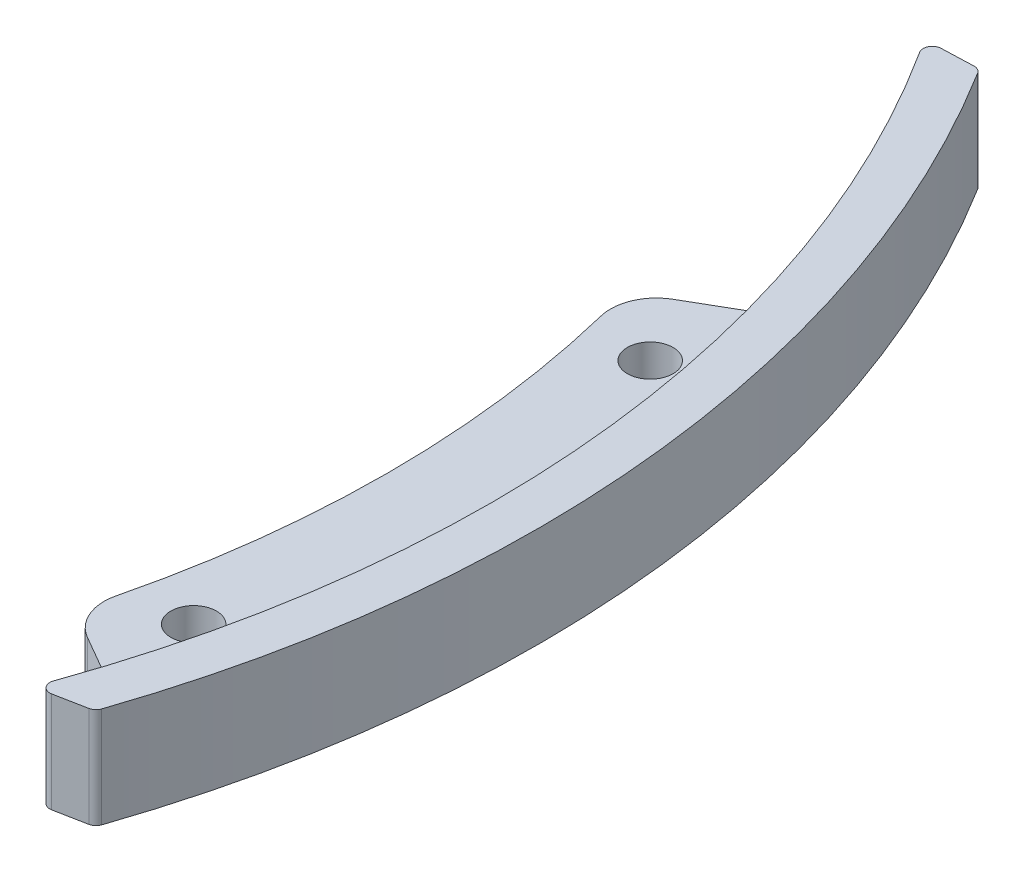
ISO-10303-21;
HEADER;
FILE_DESCRIPTION(('STEP AP214'),'2;1');
FILE_NAME('part.step','',(''),(''),'','','');
FILE_SCHEMA(('AUTOMOTIVE_DESIGN { 1 0 10303 214 1 1 1 1 }'));
ENDSEC;
DATA;
#1=APPLICATION_CONTEXT('core data for automotive mechanical design processes');
#2=APPLICATION_PROTOCOL_DEFINITION('international standard','automotive_design',2000,#1);
#3=PRODUCT_CONTEXT('',#1,'mechanical');
#4=PRODUCT('Part','Part','',(#3));
#5=PRODUCT_RELATED_PRODUCT_CATEGORY('part','',(#4));
#6=PRODUCT_DEFINITION_FORMATION('','',#4);
#7=PRODUCT_DEFINITION_CONTEXT('part definition',#1,'design');
#8=PRODUCT_DEFINITION('design','',#6,#7);
#9=PRODUCT_DEFINITION_SHAPE('','',#8);
#10=(LENGTH_UNIT() NAMED_UNIT(*) SI_UNIT(.MILLI.,.METRE.));
#11=(NAMED_UNIT(*) PLANE_ANGLE_UNIT() SI_UNIT($,.RADIAN.));
#12=(NAMED_UNIT(*) SI_UNIT($,.STERADIAN.) SOLID_ANGLE_UNIT());
#13=UNCERTAINTY_MEASURE_WITH_UNIT(LENGTH_MEASURE(1.E-05),#10,'distance_accuracy_value','');
#14=(GEOMETRIC_REPRESENTATION_CONTEXT(3) GLOBAL_UNCERTAINTY_ASSIGNED_CONTEXT((#13)) GLOBAL_UNIT_ASSIGNED_CONTEXT((#10,
#11,#12)) REPRESENTATION_CONTEXT('',''));
#15=CARTESIAN_POINT('',(0.,0.,0.));
#16=DIRECTION('',(0.,0.,1.));
#17=DIRECTION('',(1.,0.,0.));
#18=AXIS2_PLACEMENT_3D('',#15,#16,#17);
#19=CARTESIAN_POINT('',(0.,2.5,0.));
#20=DIRECTION('',(0.,1.,0.));
#21=DIRECTION('',(0.,0.,1.));
#22=AXIS2_PLACEMENT_3D('',#19,#20,#21);
#23=PLANE('',#22);
#24=CARTESIAN_POINT('',(114.80962503205,2.5,-25.));
#25=DIRECTION('',(0.,1.,0.));
#26=DIRECTION('',(0.,0.,1.));
#27=AXIS2_PLACEMENT_3D('',#24,#25,#26);
#28=CIRCLE('',#27,2.50000000000001);
#29=CARTESIAN_POINT('',(114.80962503205,2.5,-22.5));
#30=VERTEX_POINT('',#29);
#31=EDGE_CURVE('E263',#30,#30,#28,.T.);
#32=ORIENTED_EDGE('',*,*,#31,.F.);
#33=EDGE_LOOP('',(#32));
#34=FACE_BOUND('',#33,.T.);
#35=CARTESIAN_POINT('',(114.80962503205,2.5,25.));
#36=DIRECTION('',(0.,1.,0.));
#37=DIRECTION('',(0.,0.,1.));
#38=AXIS2_PLACEMENT_3D('',#35,#36,#37);
#39=CIRCLE('',#38,2.50000000000001);
#40=CARTESIAN_POINT('',(114.80962503205,2.5,27.5));
#41=VERTEX_POINT('',#40);
#42=EDGE_CURVE('E186',#41,#41,#39,.T.);
#43=ORIENTED_EDGE('',*,*,#42,.F.);
#44=EDGE_LOOP('',(#43));
#45=FACE_BOUND('',#44,.T.);
#46=CARTESIAN_POINT('',(0.,2.5,0.));
#47=DIRECTION('',(0.,1.,0.));
#48=DIRECTION('',(0.,0.,1.));
#49=AXIS2_PLACEMENT_3D('',#46,#47,#48);
#50=CIRCLE('',#49,111.1);
#51=CARTESIAN_POINT('',(107.884291904918,2.5,26.5365702413552));
#52=VERTEX_POINT('',#51);
#53=CARTESIAN_POINT('',(107.884291904918,2.5,-26.5365702413556));
#54=VERTEX_POINT('',#53);
#55=EDGE_CURVE('E254',#52,#54,#50,.T.);
#56=ORIENTED_EDGE('',*,*,#55,.F.);
#57=CARTESIAN_POINT('',(112.739570568506,2.5,27.7308353287249));
#58=DIRECTION('',(0.,1.,0.));
#59=DIRECTION('',(0.,0.,1.));
#60=AXIS2_PLACEMENT_3D('',#57,#58,#59);
#61=CIRCLE('',#60,5.);
#62=CARTESIAN_POINT('',(110.239570568506,2.5,32.0609623476471));
#63=VERTEX_POINT('',#62);
#64=EDGE_CURVE('E53',#52,#63,#61,.T.);
#65=ORIENTED_EDGE('',*,*,#64,.T.);
#66=DIRECTION('',(-0.866025403784437,0.,-0.500000000000003));
#67=VECTOR('',#66,1.);
#68=CARTESIAN_POINT('',(13.6770887107073,2.5,-23.6894125465716));
#69=LINE('',#68,#67);
#70=CARTESIAN_POINT('',(116.482793802061,2.5,35.6654889621512));
#71=VERTEX_POINT('',#70);
#72=EDGE_CURVE('E252',#71,#63,#69,.T.);
#73=ORIENTED_EDGE('',*,*,#72,.F.);
#74=CARTESIAN_POINT('',(115.982793802061,2.5,36.5315143659356));
#75=DIRECTION('',(0.,1.,0.));
#76=DIRECTION('',(0.,0.,1.));
#77=AXIS2_PLACEMENT_3D('',#74,#75,#76);
#78=CIRCLE('',#77,1.);
#79=CARTESIAN_POINT('',(116.936599672144,2.5,36.8319380038134));
#80=VERTEX_POINT('',#79);
#81=EDGE_CURVE('E234',#71,#80,#78,.F.);
#82=ORIENTED_EDGE('',*,*,#81,.T.);
#83=CARTESIAN_POINT('',(0.,2.5,0.));
#84=DIRECTION('',(0.,1.,0.));
#85=DIRECTION('',(0.,0.,1.));
#86=AXIS2_PLACEMENT_3D('',#83,#84,#85);
#87=CIRCLE('',#86,122.6);
#88=CARTESIAN_POINT('',(116.936599672144,2.5,-36.8319380038134));
#89=VERTEX_POINT('',#88);
#90=EDGE_CURVE('E279',#80,#89,#87,.T.);
#91=ORIENTED_EDGE('',*,*,#90,.T.);
#92=CARTESIAN_POINT('',(115.982793802061,2.5,-36.5315143659356));
#93=DIRECTION('',(0.,1.,0.));
#94=DIRECTION('',(0.,0.,1.));
#95=AXIS2_PLACEMENT_3D('',#92,#93,#94);
#96=CIRCLE('',#95,1.);
#97=CARTESIAN_POINT('',(116.482793802061,2.5,-35.6654889621512));
#98=VERTEX_POINT('',#97);
#99=EDGE_CURVE('E229',#89,#98,#96,.F.);
#100=ORIENTED_EDGE('',*,*,#99,.T.);
#101=DIRECTION('',(0.866025403784462,0.,-0.499999999999959));
#102=VECTOR('',#101,1.);
#103=CARTESIAN_POINT('',(13.6770887107031,2.5,23.6894125465671));
#104=LINE('',#103,#102);
#105=CARTESIAN_POINT('',(110.239570568506,2.5,-32.0609623476477));
#106=VERTEX_POINT('',#105);
#107=EDGE_CURVE('E286',#106,#98,#104,.T.);
#108=ORIENTED_EDGE('',*,*,#107,.F.);
#109=CARTESIAN_POINT('',(112.739570568506,2.5,-27.7308353287253));
#110=DIRECTION('',(0.,1.,0.));
#111=DIRECTION('',(0.,0.,1.));
#112=AXIS2_PLACEMENT_3D('',#109,#110,#111);
#113=CIRCLE('',#112,5.);
#114=EDGE_CURVE('E65',#106,#54,#113,.T.);
#115=ORIENTED_EDGE('',*,*,#114,.T.);
#116=EDGE_LOOP('',(#56,#65,#73,#82,#91,#100,#108,#115));
#117=FACE_BOUND('',#116,.T.);
#118=ADVANCED_FACE('F45',(#34,#45,#117),#23,.T.);
#119=CARTESIAN_POINT('',(0.,-2.5,0.));
#120=DIRECTION('',(0.,1.,0.));
#121=DIRECTION('',(0.,0.,1.));
#122=AXIS2_PLACEMENT_3D('',#119,#120,#121);
#123=PLANE('',#122);
#124=CARTESIAN_POINT('',(114.80962503205,-2.5,25.));
#125=DIRECTION('',(0.,1.,0.));
#126=DIRECTION('',(0.,0.,1.));
#127=AXIS2_PLACEMENT_3D('',#124,#125,#126);
#128=CIRCLE('',#127,2.50000000000001);
#129=CARTESIAN_POINT('',(114.80962503205,-2.5,27.5));
#130=VERTEX_POINT('',#129);
#131=EDGE_CURVE('E284',#130,#130,#128,.T.);
#132=ORIENTED_EDGE('',*,*,#131,.T.);
#133=EDGE_LOOP('',(#132));
#134=FACE_BOUND('',#133,.T.);
#135=CARTESIAN_POINT('',(114.80962503205,-2.5,-25.));
#136=DIRECTION('',(0.,1.,0.));
#137=DIRECTION('',(0.,0.,1.));
#138=AXIS2_PLACEMENT_3D('',#135,#136,#137);
#139=CIRCLE('',#138,2.50000000000001);
#140=CARTESIAN_POINT('',(114.80962503205,-2.5,-22.5));
#141=VERTEX_POINT('',#140);
#142=EDGE_CURVE('E277',#141,#141,#139,.T.);
#143=ORIENTED_EDGE('',*,*,#142,.T.);
#144=EDGE_LOOP('',(#143));
#145=FACE_BOUND('',#144,.T.);
#146=DIRECTION('',(-0.866025403784437,0.,-0.500000000000003));
#147=VECTOR('',#146,1.);
#148=CARTESIAN_POINT('',(13.6770887107073,-2.5,-23.6894125465716));
#149=LINE('',#148,#147);
#150=CARTESIAN_POINT('',(116.482793802061,-2.5,35.6654889621512));
#151=VERTEX_POINT('',#150);
#152=CARTESIAN_POINT('',(110.239570568506,-2.5,32.0609623476471));
#153=VERTEX_POINT('',#152);
#154=EDGE_CURVE('E271',#151,#153,#149,.T.);
#155=ORIENTED_EDGE('',*,*,#154,.T.);
#156=CARTESIAN_POINT('',(112.739570568506,-2.5,27.7308353287249));
#157=DIRECTION('',(0.,1.,0.));
#158=DIRECTION('',(0.,0.,1.));
#159=AXIS2_PLACEMENT_3D('',#156,#157,#158);
#160=CIRCLE('',#159,5.);
#161=CARTESIAN_POINT('',(107.884291904918,-2.5,26.5365702413552));
#162=VERTEX_POINT('',#161);
#163=EDGE_CURVE('E242',#153,#162,#160,.F.);
#164=ORIENTED_EDGE('',*,*,#163,.T.);
#165=CARTESIAN_POINT('',(0.,-2.5,0.));
#166=DIRECTION('',(0.,1.,0.));
#167=DIRECTION('',(0.,0.,1.));
#168=AXIS2_PLACEMENT_3D('',#165,#166,#167);
#169=CIRCLE('',#168,111.1);
#170=CARTESIAN_POINT('',(107.884291904918,-2.5,-26.5365702413556));
#171=VERTEX_POINT('',#170);
#172=EDGE_CURVE('E270',#162,#171,#169,.T.);
#173=ORIENTED_EDGE('',*,*,#172,.T.);
#174=CARTESIAN_POINT('',(112.739570568506,-2.5,-27.7308353287253));
#175=DIRECTION('',(0.,1.,0.));
#176=DIRECTION('',(0.,0.,1.));
#177=AXIS2_PLACEMENT_3D('',#174,#175,#176);
#178=CIRCLE('',#177,5.);
#179=CARTESIAN_POINT('',(110.239570568506,-2.5,-32.0609623476477));
#180=VERTEX_POINT('',#179);
#181=EDGE_CURVE('E240',#171,#180,#178,.F.);
#182=ORIENTED_EDGE('',*,*,#181,.T.);
#183=DIRECTION('',(0.866025403784462,0.,-0.499999999999959));
#184=VECTOR('',#183,1.);
#185=CARTESIAN_POINT('',(13.6770887107031,-2.5,23.6894125465671));
#186=LINE('',#185,#184);
#187=CARTESIAN_POINT('',(116.482793802061,-2.5,-35.6654889621512));
#188=VERTEX_POINT('',#187);
#189=EDGE_CURVE('E275',#180,#188,#186,.T.);
#190=ORIENTED_EDGE('',*,*,#189,.T.);
#191=CARTESIAN_POINT('',(115.982793802061,-2.5,-36.5315143659356));
#192=DIRECTION('',(0.,1.,0.));
#193=DIRECTION('',(0.,0.,1.));
#194=AXIS2_PLACEMENT_3D('',#191,#192,#193);
#195=CIRCLE('',#194,1.);
#196=CARTESIAN_POINT('',(116.936599672144,-2.5,-36.8319380038134));
#197=VERTEX_POINT('',#196);
#198=EDGE_CURVE('E226',#188,#197,#195,.T.);
#199=ORIENTED_EDGE('',*,*,#198,.T.);
#200=CARTESIAN_POINT('',(0.,-2.5,0.));
#201=DIRECTION('',(0.,1.,0.));
#202=DIRECTION('',(0.,0.,1.));
#203=AXIS2_PLACEMENT_3D('',#200,#201,#202);
#204=CIRCLE('',#203,122.6);
#205=CARTESIAN_POINT('',(116.936599672144,-2.5,36.8319380038134));
#206=VERTEX_POINT('',#205);
#207=EDGE_CURVE('E183',#206,#197,#204,.T.);
#208=ORIENTED_EDGE('',*,*,#207,.F.);
#209=CARTESIAN_POINT('',(115.982793802061,-2.5,36.5315143659356));
#210=DIRECTION('',(0.,1.,0.));
#211=DIRECTION('',(0.,0.,1.));
#212=AXIS2_PLACEMENT_3D('',#209,#210,#211);
#213=CIRCLE('',#212,1.);
#214=EDGE_CURVE('E232',#206,#151,#213,.T.);
#215=ORIENTED_EDGE('',*,*,#214,.T.);
#216=EDGE_LOOP('',(#155,#164,#173,#182,#190,#199,#208,#215));
#217=FACE_BOUND('',#216,.T.);
#218=ADVANCED_FACE('F269',(#134,#145,#217),#123,.F.);
#219=CARTESIAN_POINT('',(-2.26356606892201,2.5,-63.7598327213274));
#220=DIRECTION('',(-0.0354790919893731,0.,-0.99937041882958));
#221=DIRECTION('',(-0.99937041882958,0.,0.0354790919893731));
#222=AXIS2_PLACEMENT_3D('',#219,#220,#221);
#223=PLANE('',#222);
#224=DIRECTION('',(0.99937041882958,0.,-0.0354790919893731));
#225=VECTOR('',#224,1.);
#226=CARTESIAN_POINT('',(-2.26356606892201,5.5,-63.7598327213274));
#227=LINE('',#226,#225);
#228=CARTESIAN_POINT('',(104.126538049028,5.5,-67.5368349415656));
#229=VERTEX_POINT('',#228);
#230=CARTESIAN_POINT('',(107.593201699352,5.5,-67.6599065036498));
#231=VERTEX_POINT('',#230);
#232=EDGE_CURVE('E395',#229,#231,#227,.T.);
#233=ORIENTED_EDGE('',*,*,#232,.T.);
#234=DIRECTION('',(0.,-1.,0.));
#235=VECTOR('',#234,1.);
#236=CARTESIAN_POINT('',(107.593201699352,2.5,-67.6599065036498));
#237=LINE('',#236,#235);
#238=CARTESIAN_POINT('',(107.593201699352,-5.5,-67.6599065036498));
#239=VERTEX_POINT('',#238);
#240=EDGE_CURVE('E178',#231,#239,#237,.T.);
#241=ORIENTED_EDGE('',*,*,#240,.T.);
#242=DIRECTION('',(0.99937041882958,0.,-0.0354790919893731));
#243=VECTOR('',#242,1.);
#244=CARTESIAN_POINT('',(-2.26356606892201,-5.5,-63.7598327213274));
#245=LINE('',#244,#243);
#246=CARTESIAN_POINT('',(104.126538049028,-5.5,-67.5368349415656));
#247=VERTEX_POINT('',#246);
#248=EDGE_CURVE('E161',#247,#239,#245,.T.);
#249=ORIENTED_EDGE('',*,*,#248,.F.);
#250=DIRECTION('',(0.,1.,0.));
#251=VECTOR('',#250,1.);
#252=CARTESIAN_POINT('',(104.126538049028,5.5,-67.5368349415656));
#253=LINE('',#252,#251);
#254=EDGE_CURVE('E175',#247,#229,#253,.T.);
#255=ORIENTED_EDGE('',*,*,#254,.T.);
#256=EDGE_LOOP('',(#233,#241,#249,#255));
#257=FACE_BOUND('',#256,.T.);
#258=ADVANCED_FACE('F174',(#257),#223,.T.);
#259=CARTESIAN_POINT('',(13.6770887107031,2.5,23.6894125465671));
#260=DIRECTION('',(-0.499999999999959,0.,-0.866025403784462));
#261=DIRECTION('',(-0.866025403784462,0.,0.499999999999959));
#262=AXIS2_PLACEMENT_3D('',#259,#260,#261);
#263=PLANE('',#262);
#264=ORIENTED_EDGE('',*,*,#189,.F.);
#265=DIRECTION('',(0.,-1.,0.));
#266=VECTOR('',#265,1.);
#267=CARTESIAN_POINT('',(110.239570568506,2.5,-32.0609623476477));
#268=LINE('',#267,#266);
#269=EDGE_CURVE('E11',#180,#106,#268,.F.);
#270=ORIENTED_EDGE('',*,*,#269,.T.);
#271=ORIENTED_EDGE('',*,*,#107,.T.);
#272=DIRECTION('',(0.,-1.,0.));
#273=VECTOR('',#272,1.);
#274=CARTESIAN_POINT('',(116.482793802061,2.5,-35.6654889621512));
#275=LINE('',#274,#273);
#276=EDGE_CURVE('E221',#98,#188,#275,.T.);
#277=ORIENTED_EDGE('',*,*,#276,.T.);
#278=EDGE_LOOP('',(#264,#270,#271,#277));
#279=FACE_BOUND('',#278,.T.);
#280=ADVANCED_FACE('F336',(#279),#263,.T.);
#281=CARTESIAN_POINT('',(0.,2.5,0.));
#282=DIRECTION('',(0.,-1.,0.));
#283=DIRECTION('',(0.,0.,-1.));
#284=AXIS2_PLACEMENT_3D('',#281,#282,#283);
#285=CYLINDRICAL_SURFACE('',#284,111.1);
#286=ORIENTED_EDGE('',*,*,#172,.F.);
#287=DIRECTION('',(0.,-1.,0.));
#288=VECTOR('',#287,1.);
#289=CARTESIAN_POINT('',(107.884291904918,2.5,26.5365702413552));
#290=LINE('',#289,#288);
#291=EDGE_CURVE('E247',#162,#52,#290,.F.);
#292=ORIENTED_EDGE('',*,*,#291,.T.);
#293=ORIENTED_EDGE('',*,*,#55,.T.);
#294=DIRECTION('',(0.,-1.,0.));
#295=VECTOR('',#294,1.);
#296=CARTESIAN_POINT('',(107.884291904918,2.5,-26.5365702413556));
#297=LINE('',#296,#295);
#298=EDGE_CURVE('E244',#54,#171,#297,.T.);
#299=ORIENTED_EDGE('',*,*,#298,.T.);
#300=EDGE_LOOP('',(#286,#292,#293,#299));
#301=FACE_BOUND('',#300,.T.);
#302=ADVANCED_FACE('F273',(#301),#285,.F.);
#303=CARTESIAN_POINT('',(13.6770887107073,2.5,-23.6894125465716));
#304=DIRECTION('',(-0.500000000000003,0.,0.866025403784437));
#305=DIRECTION('',(0.866025403784437,0.,0.500000000000003));
#306=AXIS2_PLACEMENT_3D('',#303,#304,#305);
#307=PLANE('',#306);
#308=ORIENTED_EDGE('',*,*,#72,.T.);
#309=DIRECTION('',(0.,-1.,0.));
#310=VECTOR('',#309,1.);
#311=CARTESIAN_POINT('',(110.239570568506,2.5,32.0609623476471));
#312=LINE('',#311,#310);
#313=EDGE_CURVE('E237',#63,#153,#312,.T.);
#314=ORIENTED_EDGE('',*,*,#313,.T.);
#315=ORIENTED_EDGE('',*,*,#154,.F.);
#316=DIRECTION('',(0.,-1.,0.));
#317=VECTOR('',#316,1.);
#318=CARTESIAN_POINT('',(116.482793802061,2.5,35.6654889621512));
#319=LINE('',#318,#317);
#320=EDGE_CURVE('E224',#151,#71,#319,.F.);
#321=ORIENTED_EDGE('',*,*,#320,.T.);
#322=EDGE_LOOP('',(#308,#314,#315,#321));
#323=FACE_BOUND('',#322,.T.);
#324=ADVANCED_FACE('F259',(#323),#307,.T.);
#325=CARTESIAN_POINT('',(0.,2.5,0.));
#326=DIRECTION('',(0.,-1.,0.));
#327=DIRECTION('',(0.,0.,-1.));
#328=AXIS2_PLACEMENT_3D('',#325,#326,#327);
#329=CYLINDRICAL_SURFACE('',#328,122.6);
#330=CARTESIAN_POINT('',(0.,-5.5,0.));
#331=DIRECTION('',(0.,1.,0.));
#332=DIRECTION('',(0.,0.,1.));
#333=AXIS2_PLACEMENT_3D('',#330,#331,#332);
#334=CIRCLE('',#333,122.6);
#335=CARTESIAN_POINT('',(103.319282374505,-5.5,-65.999135521743));
#336=VERTEX_POINT('',#335);
#337=CARTESIAN_POINT('',(115.51779098221,-5.5,41.065800449894));
#338=VERTEX_POINT('',#337);
#339=EDGE_CURVE('E163',#336,#338,#334,.F.);
#340=ORIENTED_EDGE('',*,*,#339,.T.);
#341=DIRECTION('',(0.,-1.,0.));
#342=VECTOR('',#341,1.);
#343=CARTESIAN_POINT('',(115.51779098221,2.5,41.065800449894));
#344=LINE('',#343,#342);
#345=CARTESIAN_POINT('',(115.51779098221,5.5,41.065800449894));
#346=VERTEX_POINT('',#345);
#347=EDGE_CURVE('E219',#338,#346,#344,.F.);
#348=ORIENTED_EDGE('',*,*,#347,.T.);
#349=CARTESIAN_POINT('',(0.,5.5,0.));
#350=DIRECTION('',(0.,1.,0.));
#351=DIRECTION('',(0.,0.,1.));
#352=AXIS2_PLACEMENT_3D('',#349,#350,#351);
#353=CIRCLE('',#352,122.6);
#354=CARTESIAN_POINT('',(103.319282374505,5.5,-65.999135521743));
#355=VERTEX_POINT('',#354);
#356=EDGE_CURVE('E386',#355,#346,#353,.F.);
#357=ORIENTED_EDGE('',*,*,#356,.F.);
#358=DIRECTION('',(0.,-1.,0.));
#359=VECTOR('',#358,1.);
#360=CARTESIAN_POINT('',(103.319282374505,2.5,-65.999135521743));
#361=LINE('',#360,#359);
#362=EDGE_CURVE('E217',#355,#336,#361,.T.);
#363=ORIENTED_EDGE('',*,*,#362,.T.);
#364=EDGE_LOOP('',(#340,#348,#357,#363));
#365=FACE_BOUND('',#364,.T.);
#366=ORIENTED_EDGE('',*,*,#207,.T.);
#367=DIRECTION('',(0.,-1.,0.));
#368=VECTOR('',#367,1.);
#369=CARTESIAN_POINT('',(116.936599672144,2.5,-36.8319380038134));
#370=LINE('',#369,#368);
#371=EDGE_CURVE('E214',#197,#89,#370,.F.);
#372=ORIENTED_EDGE('',*,*,#371,.T.);
#373=ORIENTED_EDGE('',*,*,#90,.F.);
#374=DIRECTION('',(0.,-1.,0.));
#375=VECTOR('',#374,1.);
#376=CARTESIAN_POINT('',(116.936599672144,2.5,36.8319380038134));
#377=LINE('',#376,#375);
#378=EDGE_CURVE('E211',#80,#206,#377,.T.);
#379=ORIENTED_EDGE('',*,*,#378,.T.);
#380=EDGE_LOOP('',(#366,#372,#373,#379));
#381=FACE_BOUND('',#380,.T.);
#382=ADVANCED_FACE('F327',(#365,#381),#329,.F.);
#383=CARTESIAN_POINT('',(12.1372905782304,2.5,62.6348639131571));
#384=DIRECTION('',(-0.190239664235583,0.,-0.981737678889597));
#385=DIRECTION('',(-0.981737678889597,0.,0.190239664235583));
#386=AXIS2_PLACEMENT_3D('',#383,#384,#385);
#387=PLANE('',#386);
#388=DIRECTION('',(0.981737678889597,0.,-0.190239664235583));
#389=VECTOR('',#388,1.);
#390=CARTESIAN_POINT('',(12.1372905782304,5.5,62.6348639131571));
#391=LINE('',#390,#389);
#392=CARTESIAN_POINT('',(116.650263851847,5.5,42.3824957180975));
#393=VERTEX_POINT('',#392);
#394=CARTESIAN_POINT('',(120.055762215052,5.5,41.7225833208228));
#395=VERTEX_POINT('',#394);
#396=EDGE_CURVE('E381',#393,#395,#391,.T.);
#397=ORIENTED_EDGE('',*,*,#396,.F.);
#398=DIRECTION('',(0.,-1.,0.));
#399=VECTOR('',#398,1.);
#400=CARTESIAN_POINT('',(116.650263851847,2.5,42.3824957180975));
#401=LINE('',#400,#399);
#402=CARTESIAN_POINT('',(116.650263851847,-5.5,42.3824957180975));
#403=VERTEX_POINT('',#402);
#404=EDGE_CURVE('E208',#393,#403,#401,.T.);
#405=ORIENTED_EDGE('',*,*,#404,.T.);
#406=DIRECTION('',(0.981737678889597,0.,-0.190239664235583));
#407=VECTOR('',#406,1.);
#408=CARTESIAN_POINT('',(12.1372905782304,-5.5,62.6348639131571));
#409=LINE('',#408,#407);
#410=CARTESIAN_POINT('',(120.055762215052,-5.5,41.7225833208228));
#411=VERTEX_POINT('',#410);
#412=EDGE_CURVE('E391',#403,#411,#409,.T.);
#413=ORIENTED_EDGE('',*,*,#412,.T.);
#414=DIRECTION('',(0.,1.,0.));
#415=VECTOR('',#414,1.);
#416=CARTESIAN_POINT('',(120.055762215052,5.5,41.7225833208229));
#417=LINE('',#416,#415);
#418=EDGE_CURVE('E206',#411,#395,#417,.T.);
#419=ORIENTED_EDGE('',*,*,#418,.T.);
#420=EDGE_LOOP('',(#397,#405,#413,#419));
#421=FACE_BOUND('',#420,.T.);
#422=ADVANCED_FACE('F320',(#421),#387,.F.);
#423=CARTESIAN_POINT('',(114.80962503205,2.5,-25.));
#424=DIRECTION('',(0.,-1.,0.));
#425=DIRECTION('',(0.,0.,-1.));
#426=AXIS2_PLACEMENT_3D('',#423,#424,#425);
#427=CYLINDRICAL_SURFACE('',#426,2.50000000000001);
#428=ORIENTED_EDGE('',*,*,#31,.T.);
#429=EDGE_LOOP('',(#428));
#430=FACE_BOUND('',#429,.T.);
#431=ORIENTED_EDGE('',*,*,#142,.F.);
#432=EDGE_LOOP('',(#431));
#433=FACE_BOUND('',#432,.T.);
#434=ADVANCED_FACE('F317',(#430,#433),#427,.F.);
#435=CARTESIAN_POINT('',(0.,2.5,0.));
#436=DIRECTION('',(0.,-1.,0.));
#437=DIRECTION('',(0.,0.,-1.));
#438=AXIS2_PLACEMENT_3D('',#435,#436,#437);
#439=CYLINDRICAL_SURFACE('',#438,127.6);
#440=CARTESIAN_POINT('',(0.,-5.5,0.));
#441=DIRECTION('',(0.,1.,0.));
#442=DIRECTION('',(0.,0.,1.));
#443=AXIS2_PLACEMENT_3D('',#440,#441,#442);
#444=CIRCLE('',#443,127.6);
#445=CARTESIAN_POINT('',(108.478828348935,-5.5,-67.1870806036576));
#446=VERTEX_POINT('',#445);
#447=CARTESIAN_POINT('',(120.812327626257,-5.5,41.0626532694367));
#448=VERTEX_POINT('',#447);
#449=EDGE_CURVE('E393',#446,#448,#444,.F.);
#450=ORIENTED_EDGE('',*,*,#449,.F.);
#451=DIRECTION('',(0.,-1.,0.));
#452=VECTOR('',#451,1.);
#453=CARTESIAN_POINT('',(108.478828348935,2.5,-67.1870806036576));
#454=LINE('',#453,#452);
#455=CARTESIAN_POINT('',(108.478828348935,5.5,-67.1870806036576));
#456=VERTEX_POINT('',#455);
#457=EDGE_CURVE('E197',#446,#456,#454,.F.);
#458=ORIENTED_EDGE('',*,*,#457,.T.);
#459=CARTESIAN_POINT('',(0.,5.5,0.));
#460=DIRECTION('',(0.,1.,0.));
#461=DIRECTION('',(0.,0.,1.));
#462=AXIS2_PLACEMENT_3D('',#459,#460,#461);
#463=CIRCLE('',#462,127.6);
#464=CARTESIAN_POINT('',(120.812327626257,5.5,41.0626532694367));
#465=VERTEX_POINT('',#464);
#466=EDGE_CURVE('E379',#456,#465,#463,.F.);
#467=ORIENTED_EDGE('',*,*,#466,.T.);
#468=DIRECTION('',(0.,-1.,0.));
#469=VECTOR('',#468,1.);
#470=CARTESIAN_POINT('',(120.812327626257,2.5,41.0626532694367));
#471=LINE('',#470,#469);
#472=EDGE_CURVE('E194',#465,#448,#471,.T.);
#473=ORIENTED_EDGE('',*,*,#472,.T.);
#474=EDGE_LOOP('',(#450,#458,#467,#473));
#475=FACE_BOUND('',#474,.T.);
#476=ADVANCED_FACE('F316',(#475),#439,.T.);
#477=CARTESIAN_POINT('',(114.80962503205,2.5,25.));
#478=DIRECTION('',(0.,-1.,0.));
#479=DIRECTION('',(0.,0.,-1.));
#480=AXIS2_PLACEMENT_3D('',#477,#478,#479);
#481=CYLINDRICAL_SURFACE('',#480,2.50000000000001);
#482=ORIENTED_EDGE('',*,*,#42,.T.);
#483=EDGE_LOOP('',(#482));
#484=FACE_BOUND('',#483,.T.);
#485=ORIENTED_EDGE('',*,*,#131,.F.);
#486=EDGE_LOOP('',(#485));
#487=FACE_BOUND('',#486,.T.);
#488=ADVANCED_FACE('F298',(#484,#487),#481,.F.);
#489=CARTESIAN_POINT('',(0.,-5.5,0.));
#490=DIRECTION('',(0.,1.,0.));
#491=DIRECTION('',(0.,0.,1.));
#492=AXIS2_PLACEMENT_3D('',#489,#490,#491);
#493=PLANE('',#492);
#494=ORIENTED_EDGE('',*,*,#248,.T.);
#495=CARTESIAN_POINT('',(107.628680791341,-5.5,-66.6605360848202));
#496=DIRECTION('',(0.,1.,0.));
#497=DIRECTION('',(0.,0.,1.));
#498=AXIS2_PLACEMENT_3D('',#495,#496,#497);
#499=CIRCLE('',#498,1.);
#500=EDGE_CURVE('E192',#239,#446,#499,.F.);
#501=ORIENTED_EDGE('',*,*,#500,.T.);
#502=ORIENTED_EDGE('',*,*,#449,.T.);
#503=CARTESIAN_POINT('',(119.865522550816,-5.5,40.7408456419333));
#504=DIRECTION('',(0.,1.,0.));
#505=DIRECTION('',(0.,0.,1.));
#506=AXIS2_PLACEMENT_3D('',#503,#504,#505);
#507=CIRCLE('',#506,1.);
#508=EDGE_CURVE('E169',#448,#411,#507,.F.);
#509=ORIENTED_EDGE('',*,*,#508,.T.);
#510=ORIENTED_EDGE('',*,*,#412,.F.);
#511=CARTESIAN_POINT('',(116.460024187611,-5.5,41.4007580392079));
#512=DIRECTION('',(0.,1.,0.));
#513=DIRECTION('',(0.,0.,1.));
#514=AXIS2_PLACEMENT_3D('',#511,#512,#513);
#515=CIRCLE('',#514,1.);
#516=EDGE_CURVE('E168',#403,#338,#515,.F.);
#517=ORIENTED_EDGE('',*,*,#516,.T.);
#518=ORIENTED_EDGE('',*,*,#339,.F.);
#519=CARTESIAN_POINT('',(104.162017141018,-5.5,-66.537464522736));
#520=DIRECTION('',(0.,1.,0.));
#521=DIRECTION('',(0.,0.,1.));
#522=AXIS2_PLACEMENT_3D('',#519,#520,#521);
#523=CIRCLE('',#522,1.);
#524=EDGE_CURVE('E158',#336,#247,#523,.F.);
#525=ORIENTED_EDGE('',*,*,#524,.T.);
#526=EDGE_LOOP('',(#494,#501,#502,#509,#510,#517,#518,#525));
#527=FACE_BOUND('',#526,.T.);
#528=ADVANCED_FACE('F160',(#527),#493,.F.);
#529=CARTESIAN_POINT('',(0.,5.5,0.));
#530=DIRECTION('',(0.,1.,0.));
#531=DIRECTION('',(0.,0.,1.));
#532=AXIS2_PLACEMENT_3D('',#529,#530,#531);
#533=PLANE('',#532);
#534=ORIENTED_EDGE('',*,*,#466,.F.);
#535=CARTESIAN_POINT('',(107.628680791341,5.5,-66.6605360848202));
#536=DIRECTION('',(0.,1.,0.));
#537=DIRECTION('',(0.,0.,1.));
#538=AXIS2_PLACEMENT_3D('',#535,#536,#537);
#539=CIRCLE('',#538,1.);
#540=EDGE_CURVE('E204',#456,#231,#539,.T.);
#541=ORIENTED_EDGE('',*,*,#540,.T.);
#542=ORIENTED_EDGE('',*,*,#232,.F.);
#543=CARTESIAN_POINT('',(104.162017141018,5.5,-66.537464522736));
#544=DIRECTION('',(0.,1.,0.));
#545=DIRECTION('',(0.,0.,1.));
#546=AXIS2_PLACEMENT_3D('',#543,#544,#545);
#547=CIRCLE('',#546,1.);
#548=EDGE_CURVE('E182',#229,#355,#547,.T.);
#549=ORIENTED_EDGE('',*,*,#548,.T.);
#550=ORIENTED_EDGE('',*,*,#356,.T.);
#551=CARTESIAN_POINT('',(116.460024187611,5.5,41.4007580392079));
#552=DIRECTION('',(0.,1.,0.));
#553=DIRECTION('',(0.,0.,1.));
#554=AXIS2_PLACEMENT_3D('',#551,#552,#553);
#555=CIRCLE('',#554,1.);
#556=EDGE_CURVE('E202',#346,#393,#555,.T.);
#557=ORIENTED_EDGE('',*,*,#556,.T.);
#558=ORIENTED_EDGE('',*,*,#396,.T.);
#559=CARTESIAN_POINT('',(119.865522550816,5.5,40.7408456419333));
#560=DIRECTION('',(0.,1.,0.));
#561=DIRECTION('',(0.,0.,1.));
#562=AXIS2_PLACEMENT_3D('',#559,#560,#561);
#563=CIRCLE('',#562,1.);
#564=EDGE_CURVE('E199',#395,#465,#563,.T.);
#565=ORIENTED_EDGE('',*,*,#564,.T.);
#566=EDGE_LOOP('',(#534,#541,#542,#549,#550,#557,#558,#565));
#567=FACE_BOUND('',#566,.T.);
#568=ADVANCED_FACE('F345',(#567),#533,.T.);
#569=CARTESIAN_POINT('',(107.628680791341,2.5,-66.6605360848202));
#570=DIRECTION('',(0.,-1.,0.));
#571=DIRECTION('',(0.,0.,-1.));
#572=AXIS2_PLACEMENT_3D('',#569,#570,#571);
#573=CYLINDRICAL_SURFACE('',#572,1.);
#574=ORIENTED_EDGE('',*,*,#540,.F.);
#575=ORIENTED_EDGE('',*,*,#457,.F.);
#576=ORIENTED_EDGE('',*,*,#500,.F.);
#577=ORIENTED_EDGE('',*,*,#240,.F.);
#578=EDGE_LOOP('',(#574,#575,#576,#577));
#579=FACE_BOUND('',#578,.T.);
#580=ADVANCED_FACE('F341',(#579),#573,.T.);
#581=CARTESIAN_POINT('',(116.460024187611,2.5,41.4007580392079));
#582=DIRECTION('',(0.,-1.,0.));
#583=DIRECTION('',(0.,0.,-1.));
#584=AXIS2_PLACEMENT_3D('',#581,#582,#583);
#585=CYLINDRICAL_SURFACE('',#584,1.);
#586=ORIENTED_EDGE('',*,*,#556,.F.);
#587=ORIENTED_EDGE('',*,*,#347,.F.);
#588=ORIENTED_EDGE('',*,*,#516,.F.);
#589=ORIENTED_EDGE('',*,*,#404,.F.);
#590=EDGE_LOOP('',(#586,#587,#588,#589));
#591=FACE_BOUND('',#590,.T.);
#592=ADVANCED_FACE('F344',(#591),#585,.T.);
#593=CARTESIAN_POINT('',(104.162017141018,2.5,-66.537464522736));
#594=DIRECTION('',(0.,-1.,0.));
#595=DIRECTION('',(0.,0.,-1.));
#596=AXIS2_PLACEMENT_3D('',#593,#594,#595);
#597=CYLINDRICAL_SURFACE('',#596,1.);
#598=ORIENTED_EDGE('',*,*,#548,.F.);
#599=ORIENTED_EDGE('',*,*,#254,.F.);
#600=ORIENTED_EDGE('',*,*,#524,.F.);
#601=ORIENTED_EDGE('',*,*,#362,.F.);
#602=EDGE_LOOP('',(#598,#599,#600,#601));
#603=FACE_BOUND('',#602,.T.);
#604=ADVANCED_FACE('F181',(#603),#597,.T.);
#605=CARTESIAN_POINT('',(119.865522550816,2.5,40.7408456419333));
#606=DIRECTION('',(0.,-1.,0.));
#607=DIRECTION('',(0.,0.,-1.));
#608=AXIS2_PLACEMENT_3D('',#605,#606,#607);
#609=CYLINDRICAL_SURFACE('',#608,1.);
#610=ORIENTED_EDGE('',*,*,#564,.F.);
#611=ORIENTED_EDGE('',*,*,#418,.F.);
#612=ORIENTED_EDGE('',*,*,#508,.F.);
#613=ORIENTED_EDGE('',*,*,#472,.F.);
#614=EDGE_LOOP('',(#610,#611,#612,#613));
#615=FACE_BOUND('',#614,.T.);
#616=ADVANCED_FACE('F352',(#615),#609,.T.);
#617=CARTESIAN_POINT('',(115.982793802061,2.5,-36.5315143659356));
#618=DIRECTION('',(0.,-1.,0.));
#619=DIRECTION('',(0.,0.,-1.));
#620=AXIS2_PLACEMENT_3D('',#617,#618,#619);
#621=CYLINDRICAL_SURFACE('',#620,1.);
#622=ORIENTED_EDGE('',*,*,#99,.F.);
#623=ORIENTED_EDGE('',*,*,#371,.F.);
#624=ORIENTED_EDGE('',*,*,#198,.F.);
#625=ORIENTED_EDGE('',*,*,#276,.F.);
#626=EDGE_LOOP('',(#622,#623,#624,#625));
#627=FACE_BOUND('',#626,.T.);
#628=ADVANCED_FACE('F355',(#627),#621,.F.);
#629=CARTESIAN_POINT('',(115.982793802061,2.5,36.5315143659356));
#630=DIRECTION('',(0.,-1.,0.));
#631=DIRECTION('',(0.,0.,-1.));
#632=AXIS2_PLACEMENT_3D('',#629,#630,#631);
#633=CYLINDRICAL_SURFACE('',#632,1.);
#634=ORIENTED_EDGE('',*,*,#81,.F.);
#635=ORIENTED_EDGE('',*,*,#320,.F.);
#636=ORIENTED_EDGE('',*,*,#214,.F.);
#637=ORIENTED_EDGE('',*,*,#378,.F.);
#638=EDGE_LOOP('',(#634,#635,#636,#637));
#639=FACE_BOUND('',#638,.T.);
#640=ADVANCED_FACE('F359',(#639),#633,.F.);
#641=CARTESIAN_POINT('',(112.739570568506,2.5,27.7308353287249));
#642=DIRECTION('',(0.,-1.,0.));
#643=DIRECTION('',(0.,0.,-1.));
#644=AXIS2_PLACEMENT_3D('',#641,#642,#643);
#645=CYLINDRICAL_SURFACE('',#644,5.);
#646=ORIENTED_EDGE('',*,*,#64,.F.);
#647=ORIENTED_EDGE('',*,*,#291,.F.);
#648=ORIENTED_EDGE('',*,*,#163,.F.);
#649=ORIENTED_EDGE('',*,*,#313,.F.);
#650=EDGE_LOOP('',(#646,#647,#648,#649));
#651=FACE_BOUND('',#650,.T.);
#652=ADVANCED_FACE('F265',(#651),#645,.T.);
#653=CARTESIAN_POINT('',(112.739570568506,2.5,-27.7308353287253));
#654=DIRECTION('',(0.,-1.,0.));
#655=DIRECTION('',(0.,0.,-1.));
#656=AXIS2_PLACEMENT_3D('',#653,#654,#655);
#657=CYLINDRICAL_SURFACE('',#656,5.);
#658=ORIENTED_EDGE('',*,*,#114,.F.);
#659=ORIENTED_EDGE('',*,*,#269,.F.);
#660=ORIENTED_EDGE('',*,*,#181,.F.);
#661=ORIENTED_EDGE('',*,*,#298,.F.);
#662=EDGE_LOOP('',(#658,#659,#660,#661));
#663=FACE_BOUND('',#662,.T.);
#664=ADVANCED_FACE('F47',(#663),#657,.T.);
#665=CLOSED_SHELL('',(#118,#218,#258,#280,#302,#324,#382,#422,#434,#476,#488,#528,#568,#580,
#592,#604,#616,#628,#640,#652,#664));
#666=MANIFOLD_SOLID_BREP('B2',#665);
#667=ADVANCED_BREP_SHAPE_REPRESENTATION('',(#18,#666),#14);
#668=SHAPE_DEFINITION_REPRESENTATION(#9,#667);
ENDSEC;
END-ISO-10303-21;
